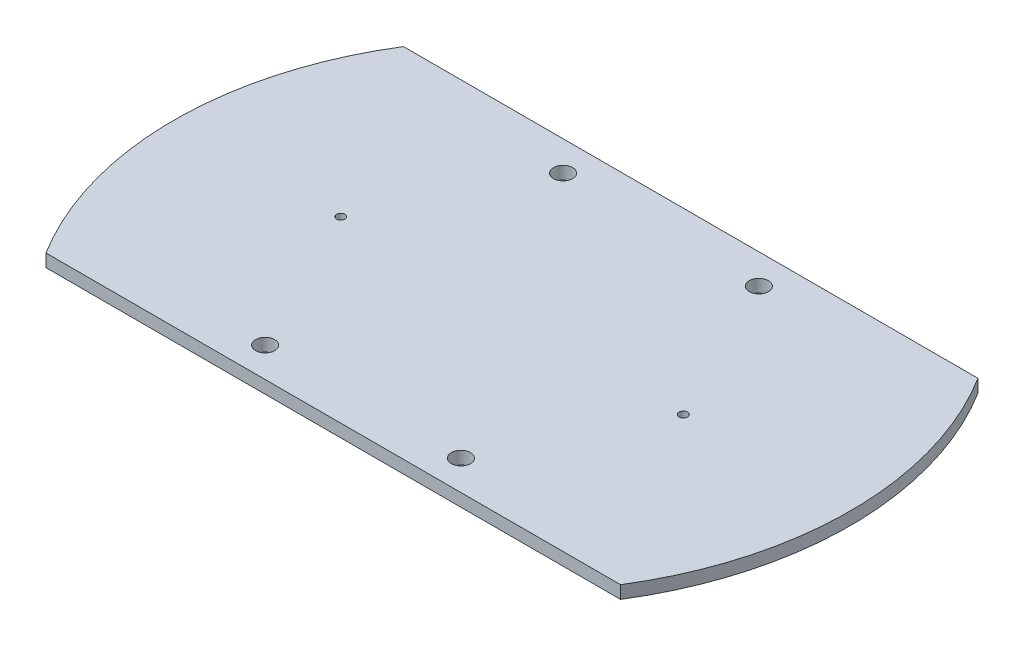
ISO-10303-21;
HEADER;
FILE_DESCRIPTION(('STEP AP214'),'2;1');
FILE_NAME('part.step','',(''),(''),'','','');
FILE_SCHEMA(('AUTOMOTIVE_DESIGN { 1 0 10303 214 1 1 1 1 }'));
ENDSEC;
DATA;
#1=APPLICATION_CONTEXT('core data for automotive mechanical design processes');
#2=APPLICATION_PROTOCOL_DEFINITION('international standard','automotive_design',2000,#1);
#3=PRODUCT_CONTEXT('',#1,'mechanical');
#4=PRODUCT('Part','Part','',(#3));
#5=PRODUCT_RELATED_PRODUCT_CATEGORY('part','',(#4));
#6=PRODUCT_DEFINITION_FORMATION('','',#4);
#7=PRODUCT_DEFINITION_CONTEXT('part definition',#1,'design');
#8=PRODUCT_DEFINITION('design','',#6,#7);
#9=PRODUCT_DEFINITION_SHAPE('','',#8);
#10=(LENGTH_UNIT() NAMED_UNIT(*) SI_UNIT(.MILLI.,.METRE.));
#11=(NAMED_UNIT(*) PLANE_ANGLE_UNIT() SI_UNIT($,.RADIAN.));
#12=(NAMED_UNIT(*) SI_UNIT($,.STERADIAN.) SOLID_ANGLE_UNIT());
#13=UNCERTAINTY_MEASURE_WITH_UNIT(LENGTH_MEASURE(1.E-05),#10,'distance_accuracy_value','');
#14=(GEOMETRIC_REPRESENTATION_CONTEXT(3) GLOBAL_UNCERTAINTY_ASSIGNED_CONTEXT((#13)) GLOBAL_UNIT_ASSIGNED_CONTEXT((#10,
#11,#12)) REPRESENTATION_CONTEXT('',''));
#15=CARTESIAN_POINT('',(0.,0.,0.));
#16=DIRECTION('',(0.,0.,1.));
#17=DIRECTION('',(1.,0.,0.));
#18=AXIS2_PLACEMENT_3D('',#15,#16,#17);
#19=CARTESIAN_POINT('',(0.,3.,0.));
#20=DIRECTION('',(0.,-1.,0.));
#21=DIRECTION('',(0.,0.,-1.));
#22=AXIS2_PLACEMENT_3D('',#19,#20,#21);
#23=CYLINDRICAL_SURFACE('',#22,79.5);
#24=CARTESIAN_POINT('',(0.,3.,0.));
#25=DIRECTION('',(0.,1.,0.));
#26=DIRECTION('',(0.,0.,1.));
#27=AXIS2_PLACEMENT_3D('',#24,#25,#26);
#28=CIRCLE('',#27,79.5);
#29=CARTESIAN_POINT('',(67.5,3.,42.));
#30=VERTEX_POINT('',#29);
#31=CARTESIAN_POINT('',(67.5,3.,-42.));
#32=VERTEX_POINT('',#31);
#33=EDGE_CURVE('E45',#30,#32,#28,.T.);
#34=ORIENTED_EDGE('',*,*,#33,.F.);
#35=DIRECTION('',(0.,1.,0.));
#36=VECTOR('',#35,1.);
#37=CARTESIAN_POINT('',(67.5,0.,42.));
#38=LINE('',#37,#36);
#39=CARTESIAN_POINT('',(67.5,0.,42.));
#40=VERTEX_POINT('',#39);
#41=EDGE_CURVE('E84',#40,#30,#38,.T.);
#42=ORIENTED_EDGE('',*,*,#41,.F.);
#43=CARTESIAN_POINT('',(0.,0.,0.));
#44=DIRECTION('',(0.,1.,0.));
#45=DIRECTION('',(0.,0.,1.));
#46=AXIS2_PLACEMENT_3D('',#43,#44,#45);
#47=CIRCLE('',#46,79.5);
#48=CARTESIAN_POINT('',(67.5,0.,-42.));
#49=VERTEX_POINT('',#48);
#50=EDGE_CURVE('E93',#40,#49,#47,.T.);
#51=ORIENTED_EDGE('',*,*,#50,.T.);
#52=DIRECTION('',(0.,1.,0.));
#53=VECTOR('',#52,1.);
#54=CARTESIAN_POINT('',(67.5,0.,-42.));
#55=LINE('',#54,#53);
#56=EDGE_CURVE('E126',#49,#32,#55,.T.);
#57=ORIENTED_EDGE('',*,*,#56,.T.);
#58=EDGE_LOOP('',(#34,#42,#51,#57));
#59=FACE_BOUND('',#58,.T.);
#60=ADVANCED_FACE('F36',(#59),#23,.T.);
#61=CARTESIAN_POINT('',(0.,3.,0.));
#62=DIRECTION('',(0.,1.,0.));
#63=DIRECTION('',(0.,0.,1.));
#64=AXIS2_PLACEMENT_3D('',#61,#62,#63);
#65=PLANE('',#64);
#66=CARTESIAN_POINT('',(-23.,3.,-35.));
#67=DIRECTION('',(0.,1.,0.));
#68=DIRECTION('',(0.,0.,1.));
#69=AXIS2_PLACEMENT_3D('',#66,#67,#68);
#70=CIRCLE('',#69,2.2479);
#71=CARTESIAN_POINT('',(-23.,3.,-32.7521));
#72=VERTEX_POINT('',#71);
#73=EDGE_CURVE('E252',#72,#72,#70,.T.);
#74=ORIENTED_EDGE('',*,*,#73,.F.);
#75=EDGE_LOOP('',(#74));
#76=FACE_BOUND('',#75,.T.);
#77=CARTESIAN_POINT('',(23.,3.,-35.));
#78=DIRECTION('',(0.,1.,0.));
#79=DIRECTION('',(0.,0.,1.));
#80=AXIS2_PLACEMENT_3D('',#77,#78,#79);
#81=CIRCLE('',#80,2.2479);
#82=CARTESIAN_POINT('',(23.,3.,-32.7521));
#83=VERTEX_POINT('',#82);
#84=EDGE_CURVE('E116',#83,#83,#81,.T.);
#85=ORIENTED_EDGE('',*,*,#84,.F.);
#86=EDGE_LOOP('',(#85));
#87=FACE_BOUND('',#86,.T.);
#88=CARTESIAN_POINT('',(23.,3.,35.));
#89=DIRECTION('',(0.,1.,0.));
#90=DIRECTION('',(0.,0.,1.));
#91=AXIS2_PLACEMENT_3D('',#88,#89,#90);
#92=CIRCLE('',#91,2.2479);
#93=CARTESIAN_POINT('',(23.,3.,37.2479));
#94=VERTEX_POINT('',#93);
#95=EDGE_CURVE('E106',#94,#94,#92,.T.);
#96=ORIENTED_EDGE('',*,*,#95,.F.);
#97=EDGE_LOOP('',(#96));
#98=FACE_BOUND('',#97,.T.);
#99=CARTESIAN_POINT('',(-23.,3.,35.));
#100=DIRECTION('',(0.,1.,0.));
#101=DIRECTION('',(0.,0.,1.));
#102=AXIS2_PLACEMENT_3D('',#99,#100,#101);
#103=CIRCLE('',#102,2.2479);
#104=CARTESIAN_POINT('',(-23.,3.,37.2479));
#105=VERTEX_POINT('',#104);
#106=EDGE_CURVE('E103',#105,#105,#103,.T.);
#107=ORIENTED_EDGE('',*,*,#106,.F.);
#108=EDGE_LOOP('',(#107));
#109=FACE_BOUND('',#108,.T.);
#110=DIRECTION('',(-1.,0.,0.));
#111=VECTOR('',#110,1.);
#112=CARTESIAN_POINT('',(-67.5,3.,42.));
#113=LINE('',#112,#111);
#114=CARTESIAN_POINT('',(-67.5,3.,42.));
#115=VERTEX_POINT('',#114);
#116=EDGE_CURVE('E53',#30,#115,#113,.T.);
#117=ORIENTED_EDGE('',*,*,#116,.F.);
#118=ORIENTED_EDGE('',*,*,#33,.T.);
#119=DIRECTION('',(1.,0.,0.));
#120=VECTOR('',#119,1.);
#121=CARTESIAN_POINT('',(-67.5,3.,-42.));
#122=LINE('',#121,#120);
#123=CARTESIAN_POINT('',(-67.5,3.,-42.));
#124=VERTEX_POINT('',#123);
#125=EDGE_CURVE('E121',#124,#32,#122,.T.);
#126=ORIENTED_EDGE('',*,*,#125,.F.);
#127=EDGE_CURVE('E11',#124,#115,#28,.T.);
#128=ORIENTED_EDGE('',*,*,#127,.T.);
#129=EDGE_LOOP('',(#117,#118,#126,#128));
#130=FACE_BOUND('',#129,.T.);
#131=CARTESIAN_POINT('',(40.25,3.,0.));
#132=DIRECTION('',(0.,1.,0.));
#133=DIRECTION('',(0.,0.,-1.));
#134=AXIS2_PLACEMENT_3D('',#131,#132,#133);
#135=CIRCLE('',#134,0.999999999999998);
#136=CARTESIAN_POINT('',(40.25,3.,-0.999999999999993));
#137=VERTEX_POINT('',#136);
#138=EDGE_CURVE('E131',#137,#137,#135,.T.);
#139=ORIENTED_EDGE('',*,*,#138,.F.);
#140=EDGE_LOOP('',(#139));
#141=FACE_BOUND('',#140,.T.);
#142=CARTESIAN_POINT('',(-40.25,3.,0.));
#143=DIRECTION('',(0.,1.,0.));
#144=DIRECTION('',(0.,0.,1.));
#145=AXIS2_PLACEMENT_3D('',#142,#143,#144);
#146=CIRCLE('',#145,0.999999999999998);
#147=CARTESIAN_POINT('',(-40.25,3.,1.));
#148=VERTEX_POINT('',#147);
#149=EDGE_CURVE('E98',#148,#148,#146,.T.);
#150=ORIENTED_EDGE('',*,*,#149,.F.);
#151=EDGE_LOOP('',(#150));
#152=FACE_BOUND('',#151,.T.);
#153=ADVANCED_FACE('F156',(#76,#87,#98,#109,#130,#141,#152),#65,.T.);
#154=CARTESIAN_POINT('',(0.,0.,0.));
#155=DIRECTION('',(0.,1.,0.));
#156=DIRECTION('',(0.,0.,1.));
#157=AXIS2_PLACEMENT_3D('',#154,#155,#156);
#158=PLANE('',#157);
#159=CARTESIAN_POINT('',(-23.,0.,-35.));
#160=DIRECTION('',(0.,1.,0.));
#161=DIRECTION('',(0.,0.,1.));
#162=AXIS2_PLACEMENT_3D('',#159,#160,#161);
#163=CIRCLE('',#162,2.2479);
#164=CARTESIAN_POINT('',(-23.,0.,-32.7521));
#165=VERTEX_POINT('',#164);
#166=EDGE_CURVE('E177',#165,#165,#163,.T.);
#167=ORIENTED_EDGE('',*,*,#166,.T.);
#168=EDGE_LOOP('',(#167));
#169=FACE_BOUND('',#168,.T.);
#170=CARTESIAN_POINT('',(23.,0.,-35.));
#171=DIRECTION('',(0.,1.,0.));
#172=DIRECTION('',(0.,0.,1.));
#173=AXIS2_PLACEMENT_3D('',#170,#171,#172);
#174=CIRCLE('',#173,2.2479);
#175=CARTESIAN_POINT('',(23.,0.,-32.7521));
#176=VERTEX_POINT('',#175);
#177=EDGE_CURVE('E40',#176,#176,#174,.T.);
#178=ORIENTED_EDGE('',*,*,#177,.T.);
#179=EDGE_LOOP('',(#178));
#180=FACE_BOUND('',#179,.T.);
#181=CARTESIAN_POINT('',(23.,0.,35.));
#182=DIRECTION('',(0.,1.,0.));
#183=DIRECTION('',(0.,0.,1.));
#184=AXIS2_PLACEMENT_3D('',#181,#182,#183);
#185=CIRCLE('',#184,2.2479);
#186=CARTESIAN_POINT('',(23.,0.,37.2479));
#187=VERTEX_POINT('',#186);
#188=EDGE_CURVE('E104',#187,#187,#185,.T.);
#189=ORIENTED_EDGE('',*,*,#188,.T.);
#190=EDGE_LOOP('',(#189));
#191=FACE_BOUND('',#190,.T.);
#192=CARTESIAN_POINT('',(-23.,0.,35.));
#193=DIRECTION('',(0.,1.,0.));
#194=DIRECTION('',(0.,0.,1.));
#195=AXIS2_PLACEMENT_3D('',#192,#193,#194);
#196=CIRCLE('',#195,2.2479);
#197=CARTESIAN_POINT('',(-23.,0.,37.2479));
#198=VERTEX_POINT('',#197);
#199=EDGE_CURVE('E101',#198,#198,#196,.T.);
#200=ORIENTED_EDGE('',*,*,#199,.T.);
#201=EDGE_LOOP('',(#200));
#202=FACE_BOUND('',#201,.T.);
#203=ORIENTED_EDGE('',*,*,#50,.F.);
#204=DIRECTION('',(-1.,0.,0.));
#205=VECTOR('',#204,1.);
#206=CARTESIAN_POINT('',(-67.5,0.,42.));
#207=LINE('',#206,#205);
#208=CARTESIAN_POINT('',(-67.5,0.,42.));
#209=VERTEX_POINT('',#208);
#210=EDGE_CURVE('E79',#40,#209,#207,.T.);
#211=ORIENTED_EDGE('',*,*,#210,.T.);
#212=CARTESIAN_POINT('',(-67.5,0.,-42.));
#213=VERTEX_POINT('',#212);
#214=EDGE_CURVE('E92',#213,#209,#47,.T.);
#215=ORIENTED_EDGE('',*,*,#214,.F.);
#216=DIRECTION('',(1.,0.,0.));
#217=VECTOR('',#216,1.);
#218=CARTESIAN_POINT('',(-67.5,0.,-42.));
#219=LINE('',#218,#217);
#220=EDGE_CURVE('E123',#213,#49,#219,.T.);
#221=ORIENTED_EDGE('',*,*,#220,.T.);
#222=EDGE_LOOP('',(#203,#211,#215,#221));
#223=FACE_BOUND('',#222,.T.);
#224=CARTESIAN_POINT('',(-40.25,0.,0.));
#225=DIRECTION('',(0.,1.,0.));
#226=DIRECTION('',(0.,0.,1.));
#227=AXIS2_PLACEMENT_3D('',#224,#225,#226);
#228=CIRCLE('',#227,0.999999999999998);
#229=CARTESIAN_POINT('',(-40.25,0.,1.));
#230=VERTEX_POINT('',#229);
#231=EDGE_CURVE('E134',#230,#230,#228,.T.);
#232=ORIENTED_EDGE('',*,*,#231,.T.);
#233=EDGE_LOOP('',(#232));
#234=FACE_BOUND('',#233,.T.);
#235=CARTESIAN_POINT('',(40.25,0.,0.));
#236=DIRECTION('',(0.,1.,0.));
#237=DIRECTION('',(0.,0.,-1.));
#238=AXIS2_PLACEMENT_3D('',#235,#236,#237);
#239=CIRCLE('',#238,0.999999999999998);
#240=CARTESIAN_POINT('',(40.25,0.,-0.999999999999993));
#241=VERTEX_POINT('',#240);
#242=EDGE_CURVE('E129',#241,#241,#239,.T.);
#243=ORIENTED_EDGE('',*,*,#242,.T.);
#244=EDGE_LOOP('',(#243));
#245=FACE_BOUND('',#244,.T.);
#246=ADVANCED_FACE('F89',(#169,#180,#191,#202,#223,#234,#245),#158,.F.);
#247=ORIENTED_EDGE('',*,*,#214,.T.);
#248=DIRECTION('',(0.,1.,0.));
#249=VECTOR('',#248,1.);
#250=CARTESIAN_POINT('',(-67.5,0.,42.));
#251=LINE('',#250,#249);
#252=EDGE_CURVE('E76',#209,#115,#251,.T.);
#253=ORIENTED_EDGE('',*,*,#252,.T.);
#254=ORIENTED_EDGE('',*,*,#127,.F.);
#255=DIRECTION('',(0.,1.,0.));
#256=VECTOR('',#255,1.);
#257=CARTESIAN_POINT('',(-67.5,0.,-42.));
#258=LINE('',#257,#256);
#259=EDGE_CURVE('E96',#213,#124,#258,.T.);
#260=ORIENTED_EDGE('',*,*,#259,.F.);
#261=EDGE_LOOP('',(#247,#253,#254,#260));
#262=FACE_BOUND('',#261,.T.);
#263=ADVANCED_FACE('F38',(#262),#23,.T.);
#264=CARTESIAN_POINT('',(-40.25,3.,0.));
#265=DIRECTION('',(0.,-1.,0.));
#266=DIRECTION('',(0.,0.,-1.));
#267=AXIS2_PLACEMENT_3D('',#264,#265,#266);
#268=CYLINDRICAL_SURFACE('',#267,0.999999999999998);
#269=ORIENTED_EDGE('',*,*,#149,.T.);
#270=EDGE_LOOP('',(#269));
#271=FACE_BOUND('',#270,.T.);
#272=ORIENTED_EDGE('',*,*,#231,.F.);
#273=EDGE_LOOP('',(#272));
#274=FACE_BOUND('',#273,.T.);
#275=ADVANCED_FACE('F142',(#271,#274),#268,.F.);
#276=CARTESIAN_POINT('',(40.25,3.,0.));
#277=DIRECTION('',(0.,-1.,0.));
#278=DIRECTION('',(0.,0.,-1.));
#279=AXIS2_PLACEMENT_3D('',#276,#277,#278);
#280=CYLINDRICAL_SURFACE('',#279,0.999999999999998);
#281=ORIENTED_EDGE('',*,*,#138,.T.);
#282=EDGE_LOOP('',(#281));
#283=FACE_BOUND('',#282,.T.);
#284=ORIENTED_EDGE('',*,*,#242,.F.);
#285=EDGE_LOOP('',(#284));
#286=FACE_BOUND('',#285,.T.);
#287=ADVANCED_FACE('F144',(#283,#286),#280,.F.);
#288=CARTESIAN_POINT('',(-67.5,0.,-42.));
#289=DIRECTION('',(0.,0.,1.));
#290=DIRECTION('',(1.,0.,0.));
#291=AXIS2_PLACEMENT_3D('',#288,#289,#290);
#292=PLANE('',#291);
#293=ORIENTED_EDGE('',*,*,#125,.T.);
#294=ORIENTED_EDGE('',*,*,#56,.F.);
#295=ORIENTED_EDGE('',*,*,#220,.F.);
#296=ORIENTED_EDGE('',*,*,#259,.T.);
#297=EDGE_LOOP('',(#293,#294,#295,#296));
#298=FACE_BOUND('',#297,.T.);
#299=ADVANCED_FACE('F151',(#298),#292,.F.);
#300=CARTESIAN_POINT('',(-67.5,0.,42.));
#301=DIRECTION('',(0.,0.,-1.));
#302=DIRECTION('',(-1.,0.,0.));
#303=AXIS2_PLACEMENT_3D('',#300,#301,#302);
#304=PLANE('',#303);
#305=ORIENTED_EDGE('',*,*,#116,.T.);
#306=ORIENTED_EDGE('',*,*,#252,.F.);
#307=ORIENTED_EDGE('',*,*,#210,.F.);
#308=ORIENTED_EDGE('',*,*,#41,.T.);
#309=EDGE_LOOP('',(#305,#306,#307,#308));
#310=FACE_BOUND('',#309,.T.);
#311=ADVANCED_FACE('F78',(#310),#304,.F.);
#312=CARTESIAN_POINT('',(-23.,3.,35.));
#313=DIRECTION('',(0.,1.,0.));
#314=DIRECTION('',(0.,0.,1.));
#315=AXIS2_PLACEMENT_3D('',#312,#313,#314);
#316=CYLINDRICAL_SURFACE('',#315,2.2479);
#317=ORIENTED_EDGE('',*,*,#106,.T.);
#318=EDGE_LOOP('',(#317));
#319=FACE_BOUND('',#318,.T.);
#320=ORIENTED_EDGE('',*,*,#199,.F.);
#321=EDGE_LOOP('',(#320));
#322=FACE_BOUND('',#321,.T.);
#323=ADVANCED_FACE('F182',(#319,#322),#316,.F.);
#324=CARTESIAN_POINT('',(23.,3.,35.));
#325=DIRECTION('',(0.,1.,0.));
#326=DIRECTION('',(0.,0.,1.));
#327=AXIS2_PLACEMENT_3D('',#324,#325,#326);
#328=CYLINDRICAL_SURFACE('',#327,2.2479);
#329=ORIENTED_EDGE('',*,*,#95,.T.);
#330=EDGE_LOOP('',(#329));
#331=FACE_BOUND('',#330,.T.);
#332=ORIENTED_EDGE('',*,*,#188,.F.);
#333=EDGE_LOOP('',(#332));
#334=FACE_BOUND('',#333,.T.);
#335=ADVANCED_FACE('F184',(#331,#334),#328,.F.);
#336=CARTESIAN_POINT('',(23.,3.,-35.));
#337=DIRECTION('',(0.,1.,0.));
#338=DIRECTION('',(0.,0.,1.));
#339=AXIS2_PLACEMENT_3D('',#336,#337,#338);
#340=CYLINDRICAL_SURFACE('',#339,2.2479);
#341=ORIENTED_EDGE('',*,*,#84,.T.);
#342=EDGE_LOOP('',(#341));
#343=FACE_BOUND('',#342,.T.);
#344=ORIENTED_EDGE('',*,*,#177,.F.);
#345=EDGE_LOOP('',(#344));
#346=FACE_BOUND('',#345,.T.);
#347=ADVANCED_FACE('F191',(#343,#346),#340,.F.);
#348=CARTESIAN_POINT('',(-23.,3.,-35.));
#349=DIRECTION('',(0.,1.,0.));
#350=DIRECTION('',(0.,0.,1.));
#351=AXIS2_PLACEMENT_3D('',#348,#349,#350);
#352=CYLINDRICAL_SURFACE('',#351,2.2479);
#353=ORIENTED_EDGE('',*,*,#73,.T.);
#354=EDGE_LOOP('',(#353));
#355=FACE_BOUND('',#354,.T.);
#356=ORIENTED_EDGE('',*,*,#166,.F.);
#357=EDGE_LOOP('',(#356));
#358=FACE_BOUND('',#357,.T.);
#359=ADVANCED_FACE('F236',(#355,#358),#352,.F.);
#360=CLOSED_SHELL('',(#60,#153,#246,#263,#275,#287,#299,#311,#323,#335,#347,#359));
#361=MANIFOLD_SOLID_BREP('B2',#360);
#362=ADVANCED_BREP_SHAPE_REPRESENTATION('',(#18,#361),#14);
#363=SHAPE_DEFINITION_REPRESENTATION(#9,#362);
ENDSEC;
END-ISO-10303-21;
